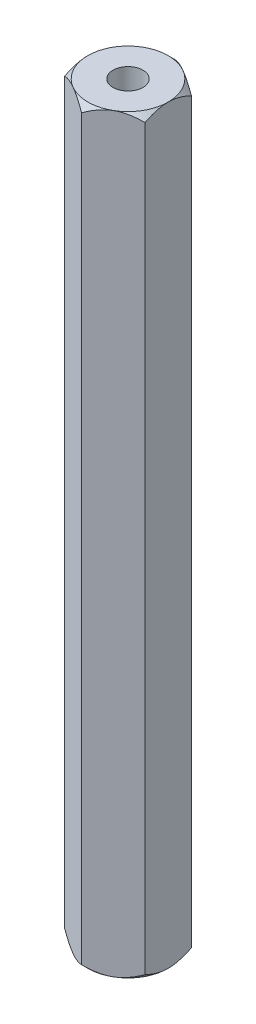
ISO-10303-21;
HEADER;
FILE_DESCRIPTION(('STEP AP214'),'2;1');
FILE_NAME('part.step','',(''),(''),'','','');
FILE_SCHEMA(('AUTOMOTIVE_DESIGN { 1 0 10303 214 1 1 1 1 }'));
ENDSEC;
DATA;
#1=APPLICATION_CONTEXT('core data for automotive mechanical design processes');
#2=APPLICATION_PROTOCOL_DEFINITION('international standard','automotive_design',2000,#1);
#3=PRODUCT_CONTEXT('',#1,'mechanical');
#4=PRODUCT('Part','Part','',(#3));
#5=PRODUCT_RELATED_PRODUCT_CATEGORY('part','',(#4));
#6=PRODUCT_DEFINITION_FORMATION('','',#4);
#7=PRODUCT_DEFINITION_CONTEXT('part definition',#1,'design');
#8=PRODUCT_DEFINITION('design','',#6,#7);
#9=PRODUCT_DEFINITION_SHAPE('','',#8);
#10=(LENGTH_UNIT() NAMED_UNIT(*) SI_UNIT(.MILLI.,.METRE.));
#11=(NAMED_UNIT(*) PLANE_ANGLE_UNIT() SI_UNIT($,.RADIAN.));
#12=(NAMED_UNIT(*) SI_UNIT($,.STERADIAN.) SOLID_ANGLE_UNIT());
#13=UNCERTAINTY_MEASURE_WITH_UNIT(LENGTH_MEASURE(1.E-05),#10,'distance_accuracy_value','');
#14=(GEOMETRIC_REPRESENTATION_CONTEXT(3) GLOBAL_UNCERTAINTY_ASSIGNED_CONTEXT((#13)) GLOBAL_UNIT_ASSIGNED_CONTEXT((#10,
#11,#12)) REPRESENTATION_CONTEXT('',''));
#15=CARTESIAN_POINT('',(0.,0.,0.));
#16=DIRECTION('',(0.,0.,1.));
#17=DIRECTION('',(1.,0.,0.));
#18=AXIS2_PLACEMENT_3D('',#15,#16,#17);
#19=CARTESIAN_POINT('',(0.,21.43125,0.));
#20=DIRECTION('',(0.,-1.,0.));
#21=DIRECTION('',(0.,0.,-1.));
#22=AXIS2_PLACEMENT_3D('',#19,#20,#21);
#23=CONICAL_SURFACE('',#22,3.17499999999999,0.78539816339745);
#24=CARTESIAN_POINT('',(0.000199999999997416,21.8565038656572,-2.74974612706943));
#25=CARTESIAN_POINT('',(-0.0816567823790523,21.9037244462749,-2.70248609172789));
#26=CARTESIAN_POINT('',(-0.164882333771762,21.9481717676915,-2.65443579722786));
#27=CARTESIAN_POINT('',(-0.334588480838042,22.0295538859988,-2.556455907536));
#28=CARTESIAN_POINT('',(-0.421085217353104,22.0664433998893,-2.50651699342501));
#29=CARTESIAN_POINT('',(-0.595501774009044,22.1296359298185,-2.40581754748857));
#30=CARTESIAN_POINT('',(-0.683377171180676,22.1560977842549,-2.35508266327639));
#31=CARTESIAN_POINT('',(-0.861062594070877,22.1968678273683,-2.25249593653966));
#32=CARTESIAN_POINT('',(-0.950867191185872,22.2112064514539,-2.20064722822085));
#33=CARTESIAN_POINT('',(-1.10563960313034,22.2241435582143,-2.11128933452158));
#34=CARTESIAN_POINT('',(-1.17040744896962,22.2260587383312,-2.07389560129144));
#35=CARTESIAN_POINT('',(-1.29983727933557,22.2228327202167,-1.99916925388849));
#36=CARTESIAN_POINT('',(-1.36449921879336,22.2176890481273,-1.96183666573622));
#37=CARTESIAN_POINT('',(-1.4932125485774,22.2006380321128,-1.88752399013711));
#38=CARTESIAN_POINT('',(-1.55726317423486,22.1887231216351,-1.85054434417201));
#39=CARTESIAN_POINT('',(-1.68425683890528,22.1587836706324,-1.77722451768917));
#40=CARTESIAN_POINT('',(-1.74719996243583,22.140759598466,-1.74088428837517));
#41=CARTESIAN_POINT('',(-1.90842615073218,22.087250535432,-1.64780030516185));
#42=CARTESIAN_POINT('',(-2.00570949128784,22.0477319221122,-1.59163374230437));
#43=CARTESIAN_POINT('',(-2.14875606262557,21.9810189994336,-1.50904576583588));
#44=CARTESIAN_POINT('',(-2.19589628894397,21.9575791338731,-1.4818293434813));
#45=CARTESIAN_POINT('',(-2.28930352636664,21.9085626663249,-1.42790064981106));
#46=CARTESIAN_POINT('',(-2.33557105249682,21.8829873762175,-1.40118808114506));
#47=CARTESIAN_POINT('',(-2.38145,21.8565038656572,-1.37469985845396));
#48=B_SPLINE_CURVE_WITH_KNOTS('',3,(#24,#25,#26,#27,#28,#29,#30,#31,#32,#33,#34,#35,#36,#37,#38,
#39,#40,#41,#42,#43,#44,#45,#46,#47),.UNSPECIFIED.,.F.,.F.,(4,2,2,2,2,2,2,2,2,2,2,4),(0.,
0.317196610611948,0.636241461041217,0.95021895062922,1.26340583824126,1.48752413747844,
1.71172100167747,1.93616888974082,2.16059957440836,2.51709639744763,2.69486147369099,
2.87251813383154),.UNSPECIFIED.);
#49=CARTESIAN_POINT('',(-1.190625,22.225,-2.0622229927617));
#50=VERTEX_POINT('',#49);
#51=CARTESIAN_POINT('',(-2.38125,21.8566193429844,-1.3748153285078));
#52=VERTEX_POINT('',#51);
#53=EDGE_CURVE('E286',#50,#52,#48,.T.);
#54=ORIENTED_EDGE('',*,*,#53,.T.);
#55=CARTESIAN_POINT('',(-2.38125,19.7460178389184,-4.23692165340734));
#56=CARTESIAN_POINT('',(-2.38125,19.8548125236186,-4.11207408962987));
#57=CARTESIAN_POINT('',(-2.38125,19.9630014982928,-3.98668790260333));
#58=CARTESIAN_POINT('',(-2.38125,20.1777354881861,-3.73441810760014));
#59=CARTESIAN_POINT('',(-2.38125,20.2842797259239,-3.60753383863596));
#60=CARTESIAN_POINT('',(-2.38125,20.4974570376868,-3.34921570361434));
#61=CARTESIAN_POINT('',(-2.38125,20.6040428221965,-3.21774266328135));
#62=CARTESIAN_POINT('',(-2.38125,20.8141107117806,-2.95238137001465));
#63=CARTESIAN_POINT('',(-2.38125,20.9175935793291,-2.81849372358448));
#64=CARTESIAN_POINT('',(-2.38125,21.1203990566302,-2.54733796573122));
#65=CARTESIAN_POINT('',(-2.38125,21.219716629089,-2.41006606284992));
#66=CARTESIAN_POINT('',(-2.38125,21.4122452338709,-2.13108753164403));
#67=CARTESIAN_POINT('',(-2.38125,21.5054513369965,-1.98937745657954));
#68=CARTESIAN_POINT('',(-2.38125,21.6819629013168,-1.70118513215734));
#69=CARTESIAN_POINT('',(-2.38125,21.7653318953251,-1.55474228924242));
#70=CARTESIAN_POINT('',(-2.38125,21.9178014544045,-1.25461518832165));
#71=CARTESIAN_POINT('',(-2.38125,21.9869274601571,-1.10094445470233));
#72=CARTESIAN_POINT('',(-2.38125,22.0747135361304,-0.862507140317603));
#73=CARTESIAN_POINT('',(-2.38125,22.1015288781413,-0.780759492808724));
#74=CARTESIAN_POINT('',(-2.38125,22.1480844456031,-0.615248355582293));
#75=CARTESIAN_POINT('',(-2.38125,22.1678257927441,-0.531485187706184));
#76=CARTESIAN_POINT('',(-2.38125,22.1989062943779,-0.362976040255643));
#77=CARTESIAN_POINT('',(-2.38125,22.2103018885502,-0.278240673845105));
#78=CARTESIAN_POINT('',(-2.38125,22.2240588979948,-0.108033963192984));
#79=CARTESIAN_POINT('',(-2.38125,22.2264215457668,-0.0225627209530799));
#80=CARTESIAN_POINT('',(-2.38125,22.2219174569688,0.148355479066417));
#81=CARTESIAN_POINT('',(-2.38125,22.215026443502,0.2338017824342));
#82=CARTESIAN_POINT('',(-2.38125,22.1925180920211,0.403529191270725));
#83=CARTESIAN_POINT('',(-2.38125,22.1768989097756,0.487810046626343));
#84=CARTESIAN_POINT('',(-2.38125,22.1378625956526,0.655184541265272));
#85=CARTESIAN_POINT('',(-2.38125,22.11438738817,0.738264383097644));
#86=CARTESIAN_POINT('',(-2.38125,22.0609694307975,0.902285884014336));
#87=CARTESIAN_POINT('',(-2.38125,22.0310264661243,0.983227471990672));
#88=CARTESIAN_POINT('',(-2.38125,21.9596468381831,1.15832978615673));
#89=CARTESIAN_POINT('',(-2.38125,21.9171072102966,1.25203669101619));
#90=CARTESIAN_POINT('',(-2.38125,21.8263360756699,1.43667584399993));
#91=CARTESIAN_POINT('',(-2.38125,21.778101349194,1.52760648564567));
#92=CARTESIAN_POINT('',(-2.38125,21.6771984957892,1.70719604162251));
#93=CARTESIAN_POINT('',(-2.38125,21.6245215787469,1.79584997643514));
#94=CARTESIAN_POINT('',(-2.38125,21.5158329172287,1.97105123995943));
#95=CARTESIAN_POINT('',(-2.38125,21.4598218205245,2.05759897329521));
#96=CARTESIAN_POINT('',(-2.38125,21.3448810721502,2.22941136493859));
#97=CARTESIAN_POINT('',(-2.38125,21.2859371476221,2.31466643045074));
#98=CARTESIAN_POINT('',(-2.38125,21.1659625155816,2.48369898527541));
#99=CARTESIAN_POINT('',(-2.38125,21.104931650476,2.56747636227462));
#100=CARTESIAN_POINT('',(-2.38125,20.9195047612154,2.81675916297002));
#101=CARTESIAN_POINT('',(-2.38125,20.7926337415803,2.9804210230883));
#102=CARTESIAN_POINT('',(-2.38125,20.5142933094313,3.32964262177486));
#103=CARTESIAN_POINT('',(-2.38125,20.3620873231987,3.51460984589197));
#104=CARTESIAN_POINT('',(-2.38125,20.1317961899971,3.78850303570508));
#105=CARTESIAN_POINT('',(-2.38125,20.0551752052054,3.8786686422443));
#106=CARTESIAN_POINT('',(-2.38125,19.9011512426555,4.05829189566911));
#107=CARTESIAN_POINT('',(-2.38125,19.8237484589111,4.14774970883097));
#108=CARTESIAN_POINT('',(-2.38125,19.7460178389184,4.23692165340734));
#109=B_SPLINE_CURVE_WITH_KNOTS('',3,(#55,#56,#57,#58,#59,#60,#61,#62,#63,#64,#65,#66,#67,#68,
#69,#70,#71,#72,#73,#74,#75,#76,#77,#78,#79,#80,#81,#82,#83,#84,#85,#86,#87,#88,#89,#90,#91,#92,
#93,#94,#95,#96,#97,#98,#99,#100,#101,#102,#103,#104,#105,#106,#107,#108),.UNSPECIFIED.,.F.,.F.,
(4,2,2,2,2,2,2,2,2,2,2,2,2,2,2,2,2,2,2,2,2,2,2,2,2,2,4),(0.,0.496808752533735,0.993845571839994,
1.50156308552919,2.00915479893864,2.51734363803646,3.02593743855607,3.53104224715954,
4.0352368681621,4.29308389437332,4.55089001687884,4.80693615994982,5.06294736557488,
5.31963152813929,5.57636994768811,5.83504984607863,6.09373833611014,6.40221158013621,
6.7108600628119,7.02013430663186,7.32934865883775,7.64025230372572,7.95117947823041,
8.57228663680331,9.29083133298711,9.64580055102219,10.0006837433332),.UNSPECIFIED.);
#110=CARTESIAN_POINT('',(-2.38125,22.225,0.));
#111=VERTEX_POINT('',#110);
#112=EDGE_CURVE('E258',#52,#111,#109,.T.);
#113=ORIENTED_EDGE('',*,*,#112,.T.);
#114=CARTESIAN_POINT('',(0.,22.225,0.));
#115=DIRECTION('',(0.,-1.,0.));
#116=DIRECTION('',(0.,0.,-1.));
#117=AXIS2_PLACEMENT_3D('',#114,#115,#116);
#118=CIRCLE('',#117,2.38125);
#119=EDGE_CURVE('E162',#111,#50,#118,.T.);
#120=ORIENTED_EDGE('',*,*,#119,.T.);
#121=EDGE_LOOP('',(#54,#113,#120));
#122=FACE_BOUND('',#121,.T.);
#123=ADVANCED_FACE('F39',(#122),#23,.T.);
#124=CARTESIAN_POINT('',(-1.190625,22.225,2.0622229927617));
#125=VERTEX_POINT('',#124);
#126=EDGE_CURVE('E164',#125,#111,#118,.T.);
#127=ORIENTED_EDGE('',*,*,#126,.T.);
#128=CARTESIAN_POINT('',(-2.38125,21.8566193429844,1.3748153285078));
#129=VERTEX_POINT('',#128);
#130=EDGE_CURVE('E259',#111,#129,#109,.T.);
#131=ORIENTED_EDGE('',*,*,#130,.T.);
#132=CARTESIAN_POINT('',(-2.38145,21.8565038656572,1.37469985845396));
#133=CARTESIAN_POINT('',(-2.29959321762095,21.9037244462749,1.4219598937955));
#134=CARTESIAN_POINT('',(-2.21636766622824,21.9481717676915,1.47001018829554));
#135=CARTESIAN_POINT('',(-2.04666151916196,22.0295538859988,1.56799007798739));
#136=CARTESIAN_POINT('',(-1.9601647826469,22.0664433998893,1.61792899209838));
#137=CARTESIAN_POINT('',(-1.78574822599096,22.1296359298185,1.71862843803482));
#138=CARTESIAN_POINT('',(-1.69787282881932,22.1560977842549,1.76936332224701));
#139=CARTESIAN_POINT('',(-1.52018740592912,22.1968678273683,1.87195004898374));
#140=CARTESIAN_POINT('',(-1.43038280881413,22.2112064514539,1.92379875730254));
#141=CARTESIAN_POINT('',(-1.27561039686966,22.2241435582143,2.01315665100181));
#142=CARTESIAN_POINT('',(-1.21084255103038,22.2260587383312,2.05055038423195));
#143=CARTESIAN_POINT('',(-1.08141272066443,22.2228327202167,2.1252767316349));
#144=CARTESIAN_POINT('',(-1.01675078120664,22.2176890481273,2.16260931978718));
#145=CARTESIAN_POINT('',(-0.888037451422602,22.2006380321128,2.23692199538629));
#146=CARTESIAN_POINT('',(-0.823986825765145,22.1887231216351,2.27390164135138));
#147=CARTESIAN_POINT('',(-0.696993161094725,22.1587836706324,2.34722146783423));
#148=CARTESIAN_POINT('',(-0.634050037564174,22.140759598466,2.38356169714823));
#149=CARTESIAN_POINT('',(-0.472823849267818,22.087250535432,2.47664568036154));
#150=CARTESIAN_POINT('',(-0.375540508712161,22.0477319221122,2.53281224321902));
#151=CARTESIAN_POINT('',(-0.232493937374431,21.9810189994336,2.61540021968751));
#152=CARTESIAN_POINT('',(-0.185353711056037,21.9575791338731,2.6426166420421));
#153=CARTESIAN_POINT('',(-0.0919464736333631,21.9085626663249,2.69654533571233));
#154=CARTESIAN_POINT('',(-0.0456789475031797,21.8829873762176,2.72325790437833));
#155=CARTESIAN_POINT('',(0.000199999999998351,21.8565038656572,2.74974612706943));
#156=B_SPLINE_CURVE_WITH_KNOTS('',3,(#132,#133,#134,#135,#136,#137,#138,#139,#140,#141,#142,
#143,#144,#145,#146,#147,#148,#149,#150,#151,#152,#153,#154,#155),.UNSPECIFIED.,.F.,.F.,(4,2,2,
2,2,2,2,2,2,2,2,4),(0.,0.317196610611949,0.63624146104122,0.950218950629223,1.26340583824126,
1.48752413747844,1.71172100167747,1.93616888974082,2.16059957440836,2.51709639744763,
2.69486147369099,2.87251813383154),.UNSPECIFIED.);
#157=EDGE_CURVE('E335',#129,#125,#156,.T.);
#158=ORIENTED_EDGE('',*,*,#157,.T.);
#159=EDGE_LOOP('',(#127,#131,#158));
#160=FACE_BOUND('',#159,.T.);
#161=ADVANCED_FACE('F334',(#160),#23,.T.);
#162=CARTESIAN_POINT('',(1.190625,22.225,2.0622229927617));
#163=VERTEX_POINT('',#162);
#164=EDGE_CURVE('E147',#163,#125,#118,.T.);
#165=ORIENTED_EDGE('',*,*,#164,.T.);
#166=CARTESIAN_POINT('',(0.,21.8566193429844,2.74963065701559));
#167=VERTEX_POINT('',#166);
#168=EDGE_CURVE('E264',#125,#167,#156,.T.);
#169=ORIENTED_EDGE('',*,*,#168,.T.);
#170=CARTESIAN_POINT('',(-0.000200000000000422,21.8565038656572,2.74974612706943));
#171=CARTESIAN_POINT('',(0.0816567823790491,21.9037244462749,2.70248609172789));
#172=CARTESIAN_POINT('',(0.164882333771759,21.9481717676915,2.65443579722785));
#173=CARTESIAN_POINT('',(0.334588480838039,22.0295538859988,2.556455907536));
#174=CARTESIAN_POINT('',(0.421085217353103,22.0664433998893,2.50651699342501));
#175=CARTESIAN_POINT('',(0.595501774009043,22.1296359298185,2.40581754748857));
#176=CARTESIAN_POINT('',(0.683377171180675,22.1560977842549,2.35508266327639));
#177=CARTESIAN_POINT('',(0.861062594070875,22.1968678273684,2.25249593653966));
#178=CARTESIAN_POINT('',(0.95086719118587,22.2112064514539,2.20064722822085));
#179=CARTESIAN_POINT('',(1.10563960313034,22.2241435582143,2.11128933452158));
#180=CARTESIAN_POINT('',(1.17040744896962,22.2260587383312,2.07389560129144));
#181=CARTESIAN_POINT('',(1.29983727933557,22.2228327202167,1.99916925388849));
#182=CARTESIAN_POINT('',(1.36449921879335,22.2176890481273,1.96183666573622));
#183=CARTESIAN_POINT('',(1.4932125485774,22.2006380321128,1.88752399013711));
#184=CARTESIAN_POINT('',(1.55726317423485,22.1887231216351,1.85054434417201));
#185=CARTESIAN_POINT('',(1.68425683890527,22.1587836706324,1.77722451768917));
#186=CARTESIAN_POINT('',(1.74719996243582,22.140759598466,1.74088428837517));
#187=CARTESIAN_POINT('',(1.90842615073218,22.087250535432,1.64780030516185));
#188=CARTESIAN_POINT('',(2.00570949128784,22.0477319221122,1.59163374230437));
#189=CARTESIAN_POINT('',(2.14875606262557,21.9810189994336,1.50904576583588));
#190=CARTESIAN_POINT('',(2.19589628894396,21.9575791338731,1.4818293434813));
#191=CARTESIAN_POINT('',(2.28930352636664,21.9085626663249,1.42790064981106));
#192=CARTESIAN_POINT('',(2.33557105249682,21.8829873762176,1.40118808114506));
#193=CARTESIAN_POINT('',(2.38145,21.8565038656572,1.37469985845396));
#194=B_SPLINE_CURVE_WITH_KNOTS('',3,(#170,#171,#172,#173,#174,#175,#176,#177,#178,#179,#180,
#181,#182,#183,#184,#185,#186,#187,#188,#189,#190,#191,#192,#193),.UNSPECIFIED.,.F.,.F.,(4,2,2,
2,2,2,2,2,2,2,2,4),(0.,0.317196610611948,0.636241461041218,0.950218950629222,1.26340583824126,
1.48752413747844,1.71172100167747,1.93616888974082,2.16059957440836,2.51709639744763,
2.69486147369099,2.87251813383154),.UNSPECIFIED.);
#195=EDGE_CURVE('E175',#167,#163,#194,.T.);
#196=ORIENTED_EDGE('',*,*,#195,.T.);
#197=EDGE_LOOP('',(#165,#169,#196));
#198=FACE_BOUND('',#197,.T.);
#199=ADVANCED_FACE('F340',(#198),#23,.T.);
#200=CARTESIAN_POINT('',(2.38145,21.8565038656572,-1.37469985845396));
#201=CARTESIAN_POINT('',(2.29959321762095,21.9037244462749,-1.4219598937955));
#202=CARTESIAN_POINT('',(2.21636766622824,21.9481717676915,-1.47001018829554));
#203=CARTESIAN_POINT('',(2.04666151916196,22.0295538859988,-1.56799007798739));
#204=CARTESIAN_POINT('',(1.9601647826469,22.0664433998893,-1.61792899209838));
#205=CARTESIAN_POINT('',(1.78574822599096,22.1296359298185,-1.71862843803482));
#206=CARTESIAN_POINT('',(1.69787282881933,22.1560977842549,-1.769363322247));
#207=CARTESIAN_POINT('',(1.52018740592912,22.1968678273684,-1.87195004898373));
#208=CARTESIAN_POINT('',(1.43038280881413,22.2112064514539,-1.92379875730254));
#209=CARTESIAN_POINT('',(1.27561039686966,22.2241435582143,-2.01315665100181));
#210=CARTESIAN_POINT('',(1.21084255103038,22.2260587383312,-2.05055038423195));
#211=CARTESIAN_POINT('',(1.08141272066443,22.2228327202167,-2.1252767316349));
#212=CARTESIAN_POINT('',(1.01675078120664,22.2176890481273,-2.16260931978717));
#213=CARTESIAN_POINT('',(0.888037451422603,22.2006380321128,-2.23692199538628));
#214=CARTESIAN_POINT('',(0.823986825765146,22.1887231216351,-2.27390164135138));
#215=CARTESIAN_POINT('',(0.696993161094726,22.1587836706324,-2.34722146783422));
#216=CARTESIAN_POINT('',(0.634050037564175,22.140759598466,-2.38356169714822));
#217=CARTESIAN_POINT('',(0.472823849267818,22.087250535432,-2.47664568036154));
#218=CARTESIAN_POINT('',(0.37554050871216,22.0477319221122,-2.53281224321902));
#219=CARTESIAN_POINT('',(0.23249393737443,21.9810189994336,-2.61540021968751));
#220=CARTESIAN_POINT('',(0.185353711056035,21.9575791338731,-2.64261664204209));
#221=CARTESIAN_POINT('',(0.0919464736333613,21.9085626663249,-2.69654533571233));
#222=CARTESIAN_POINT('',(0.0456789475031778,21.8829873762176,-2.72325790437833));
#223=CARTESIAN_POINT('',(-0.000200000000001203,21.8565038656572,-2.74974612706943));
#224=B_SPLINE_CURVE_WITH_KNOTS('',3,(#200,#201,#202,#203,#204,#205,#206,#207,#208,#209,#210,
#211,#212,#213,#214,#215,#216,#217,#218,#219,#220,#221,#222,#223),.UNSPECIFIED.,.F.,.F.,(4,2,2,
2,2,2,2,2,2,2,2,4),(0.,0.317196610611948,0.636241461041218,0.950218950629222,1.26340583824126,
1.48752413747844,1.71172100167747,1.93616888974082,2.16059957440836,2.51709639744763,
2.69486147369099,2.87251813383154),.UNSPECIFIED.);
#225=CARTESIAN_POINT('',(1.190625,22.225,-2.06222299276169));
#226=VERTEX_POINT('',#225);
#227=CARTESIAN_POINT('',(0.,21.8566193429844,-2.74963065701559));
#228=VERTEX_POINT('',#227);
#229=EDGE_CURVE('E153',#226,#228,#224,.T.);
#230=ORIENTED_EDGE('',*,*,#229,.T.);
#231=EDGE_CURVE('E159',#228,#50,#48,.T.);
#232=ORIENTED_EDGE('',*,*,#231,.T.);
#233=EDGE_CURVE('E48',#50,#226,#118,.T.);
#234=ORIENTED_EDGE('',*,*,#233,.T.);
#235=EDGE_LOOP('',(#230,#232,#234));
#236=FACE_BOUND('',#235,.T.);
#237=ADVANCED_FACE('F158',(#236),#23,.T.);
#238=CARTESIAN_POINT('',(2.38125,22.225,0.));
#239=VERTEX_POINT('',#238);
#240=EDGE_CURVE('E47',#239,#163,#118,.T.);
#241=ORIENTED_EDGE('',*,*,#240,.T.);
#242=CARTESIAN_POINT('',(2.38125,21.8566193429844,1.3748153285078));
#243=VERTEX_POINT('',#242);
#244=EDGE_CURVE('E139',#163,#243,#194,.T.);
#245=ORIENTED_EDGE('',*,*,#244,.T.);
#246=CARTESIAN_POINT('',(2.38125,19.7460178389184,4.23692165340734));
#247=CARTESIAN_POINT('',(2.38125,19.8548125236186,4.11207408962987));
#248=CARTESIAN_POINT('',(2.38125,19.9630014982928,3.98668790260332));
#249=CARTESIAN_POINT('',(2.38125,20.1777354881861,3.73441810760013));
#250=CARTESIAN_POINT('',(2.38125,20.2842797259239,3.60753383863596));
#251=CARTESIAN_POINT('',(2.38125,20.4974570376868,3.34921570361434));
#252=CARTESIAN_POINT('',(2.38125,20.6040428221965,3.21774266328135));
#253=CARTESIAN_POINT('',(2.38125,20.8141107117806,2.95238137001464));
#254=CARTESIAN_POINT('',(2.38125,20.9175935793291,2.81849372358447));
#255=CARTESIAN_POINT('',(2.38125,21.1203990566302,2.54733796573121));
#256=CARTESIAN_POINT('',(2.38125,21.219716629089,2.41006606284991));
#257=CARTESIAN_POINT('',(2.38125,21.4122452338709,2.13108753164403));
#258=CARTESIAN_POINT('',(2.38125,21.5054513369965,1.98937745657954));
#259=CARTESIAN_POINT('',(2.38125,21.6819629013168,1.70118513215734));
#260=CARTESIAN_POINT('',(2.38125,21.7653318953251,1.55474228924241));
#261=CARTESIAN_POINT('',(2.38125,21.9178014544045,1.25461518832165));
#262=CARTESIAN_POINT('',(2.38125,21.9869274601571,1.10094445470233));
#263=CARTESIAN_POINT('',(2.38125,22.0747135361304,0.862507140317599));
#264=CARTESIAN_POINT('',(2.38125,22.1015288781413,0.78075949280872));
#265=CARTESIAN_POINT('',(2.38125,22.1480844456031,0.615248355582289));
#266=CARTESIAN_POINT('',(2.38125,22.1678257927441,0.531485187706181));
#267=CARTESIAN_POINT('',(2.38125,22.1989062943779,0.36297604025564));
#268=CARTESIAN_POINT('',(2.38125,22.2103018885502,0.278240673845103));
#269=CARTESIAN_POINT('',(2.38125,22.2240588979948,0.108033963192981));
#270=CARTESIAN_POINT('',(2.38125,22.2264215457668,0.0225627209530779));
#271=CARTESIAN_POINT('',(2.38125,22.2219174569688,-0.148355479066419));
#272=CARTESIAN_POINT('',(2.38125,22.215026443502,-0.233801782434202));
#273=CARTESIAN_POINT('',(2.38125,22.1925180920211,-0.403529191270727));
#274=CARTESIAN_POINT('',(2.38125,22.1768989097756,-0.487810046626345));
#275=CARTESIAN_POINT('',(2.38125,22.1378625956526,-0.655184541265273));
#276=CARTESIAN_POINT('',(2.38125,22.11438738817,-0.738264383097644));
#277=CARTESIAN_POINT('',(2.38125,22.0609694307975,-0.902285884014336));
#278=CARTESIAN_POINT('',(2.38125,22.0310264661243,-0.983227471990672));
#279=CARTESIAN_POINT('',(2.38125,21.9596468381831,-1.15832978615673));
#280=CARTESIAN_POINT('',(2.38125,21.9171072102966,-1.25203669101619));
#281=CARTESIAN_POINT('',(2.38125,21.8263360756699,-1.43667584399993));
#282=CARTESIAN_POINT('',(2.38125,21.778101349194,-1.52760648564567));
#283=CARTESIAN_POINT('',(2.38125,21.6771984957892,-1.70719604162251));
#284=CARTESIAN_POINT('',(2.38125,21.624521578747,-1.79584997643514));
#285=CARTESIAN_POINT('',(2.38125,21.5158329172287,-1.97105123995943));
#286=CARTESIAN_POINT('',(2.38125,21.4598218205245,-2.05759897329521));
#287=CARTESIAN_POINT('',(2.38125,21.3448810721502,-2.22941136493859));
#288=CARTESIAN_POINT('',(2.38125,21.2859371476221,-2.31466643045074));
#289=CARTESIAN_POINT('',(2.38125,21.1659625155816,-2.48369898527541));
#290=CARTESIAN_POINT('',(2.38125,21.1049316504761,-2.56747636227462));
#291=CARTESIAN_POINT('',(2.38125,20.9195047612154,-2.81675916297002));
#292=CARTESIAN_POINT('',(2.38125,20.7926337415803,-2.9804210230883));
#293=CARTESIAN_POINT('',(2.38125,20.5142933094313,-3.32964262177485));
#294=CARTESIAN_POINT('',(2.38125,20.3620873231987,-3.51460984589197));
#295=CARTESIAN_POINT('',(2.38125,20.1317961899971,-3.78850303570508));
#296=CARTESIAN_POINT('',(2.38125,20.0551752052054,-3.8786686422443));
#297=CARTESIAN_POINT('',(2.38125,19.9011512426555,-4.05829189566911));
#298=CARTESIAN_POINT('',(2.38125,19.8237484589111,-4.14774970883097));
#299=CARTESIAN_POINT('',(2.38125,19.7460178389184,-4.23692165340734));
#300=B_SPLINE_CURVE_WITH_KNOTS('',3,(#246,#247,#248,#249,#250,#251,#252,#253,#254,#255,#256,
#257,#258,#259,#260,#261,#262,#263,#264,#265,#266,#267,#268,#269,#270,#271,#272,#273,#274,#275,
#276,#277,#278,#279,#280,#281,#282,#283,#284,#285,#286,#287,#288,#289,#290,#291,#292,#293,#294,
#295,#296,#297,#298,#299),.UNSPECIFIED.,.F.,.F.,(4,2,2,2,2,2,2,2,2,2,2,2,2,2,2,2,2,2,2,2,2,2,2,
2,2,2,4),(0.,0.496808752533733,0.993845571839992,1.50156308552918,2.00915479893864,
2.51734363803646,3.02593743855607,3.53104224715954,4.0352368681621,4.29308389437332,
4.55089001687884,4.80693615994982,5.06294736557488,5.31963152813929,5.57636994768811,
5.83504984607863,6.09373833611014,6.4022115801362,6.71086006281189,7.02013430663186,
7.32934865883775,7.64025230372572,7.95117947823041,8.57228663680331,9.2908313329871,
9.64580055102219,10.0006837433332),.UNSPECIFIED.);
#301=EDGE_CURVE('E129',#243,#239,#300,.T.);
#302=ORIENTED_EDGE('',*,*,#301,.T.);
#303=EDGE_LOOP('',(#241,#245,#302));
#304=FACE_BOUND('',#303,.T.);
#305=ADVANCED_FACE('F138',(#304),#23,.T.);
#306=CARTESIAN_POINT('',(2.38125,21.8566193429844,-1.3748153285078));
#307=VERTEX_POINT('',#306);
#308=EDGE_CURVE('E126',#239,#307,#300,.T.);
#309=ORIENTED_EDGE('',*,*,#308,.T.);
#310=EDGE_CURVE('E149',#307,#226,#224,.T.);
#311=ORIENTED_EDGE('',*,*,#310,.T.);
#312=EDGE_CURVE('E12',#226,#239,#118,.T.);
#313=ORIENTED_EDGE('',*,*,#312,.T.);
#314=EDGE_LOOP('',(#309,#311,#313));
#315=FACE_BOUND('',#314,.T.);
#316=ADVANCED_FACE('F148',(#315),#23,.T.);
#317=CARTESIAN_POINT('',(0.,22.225,0.));
#318=DIRECTION('',(0.,1.,0.));
#319=DIRECTION('',(0.,0.,1.));
#320=AXIS2_PLACEMENT_3D('',#317,#318,#319);
#321=PLANE('',#320);
#322=CARTESIAN_POINT('',(0.,22.225,0.));
#323=DIRECTION('',(0.,-1.,0.));
#324=DIRECTION('',(0.,0.,-1.));
#325=AXIS2_PLACEMENT_3D('',#322,#323,#324);
#326=CIRCLE('',#325,0.888999999999994);
#327=CARTESIAN_POINT('',(0.,22.225,-0.888999999999994));
#328=VERTEX_POINT('',#327);
#329=EDGE_CURVE('E315',#328,#328,#326,.T.);
#330=ORIENTED_EDGE('',*,*,#329,.T.);
#331=EDGE_LOOP('',(#330));
#332=FACE_BOUND('',#331,.T.);
#333=ORIENTED_EDGE('',*,*,#312,.F.);
#334=ORIENTED_EDGE('',*,*,#233,.F.);
#335=ORIENTED_EDGE('',*,*,#119,.F.);
#336=ORIENTED_EDGE('',*,*,#126,.F.);
#337=ORIENTED_EDGE('',*,*,#164,.F.);
#338=ORIENTED_EDGE('',*,*,#240,.F.);
#339=EDGE_LOOP('',(#333,#334,#335,#336,#337,#338));
#340=FACE_BOUND('',#339,.T.);
#341=ADVANCED_FACE('F41',(#332,#340),#321,.T.);
#342=CARTESIAN_POINT('',(0.,-22.225,2.74963065701559));
#343=DIRECTION('',(0.5,0.,0.866025403784439));
#344=DIRECTION('',(0.866025403784439,0.,-0.5));
#345=AXIS2_PLACEMENT_3D('',#342,#343,#344);
#346=PLANE('',#345);
#347=DIRECTION('',(0.,1.,0.));
#348=VECTOR('',#347,1.);
#349=CARTESIAN_POINT('',(0.,-22.225,2.74963065701559));
#350=LINE('',#349,#348);
#351=CARTESIAN_POINT('',(0.,-21.8566193429844,2.74963065701559));
#352=VERTEX_POINT('',#351);
#353=EDGE_CURVE('E324',#352,#167,#350,.T.);
#354=ORIENTED_EDGE('',*,*,#353,.F.);
#355=CARTESIAN_POINT('',(2.38145,-21.8565038656572,1.37469985845396));
#356=CARTESIAN_POINT('',(2.29959321762095,-21.9037244462749,1.4219598937955));
#357=CARTESIAN_POINT('',(2.21636766622824,-21.9481717676915,1.47001018829554));
#358=CARTESIAN_POINT('',(2.04666151916196,-22.0295538859988,1.56799007798739));
#359=CARTESIAN_POINT('',(1.9601647826469,-22.0664433998893,1.61792899209838));
#360=CARTESIAN_POINT('',(1.78574822599096,-22.1296359298185,1.71862843803482));
#361=CARTESIAN_POINT('',(1.69787282881933,-22.1560977842549,1.769363322247));
#362=CARTESIAN_POINT('',(1.52018740592913,-22.1968678273684,1.87195004898373));
#363=CARTESIAN_POINT('',(1.43038280881413,-22.2112064514539,1.92379875730254));
#364=CARTESIAN_POINT('',(1.27561039686966,-22.2241435582143,2.01315665100181));
#365=CARTESIAN_POINT('',(1.21084255103038,-22.2260587383312,2.05055038423195));
#366=CARTESIAN_POINT('',(1.08141272066443,-22.2228327202167,2.1252767316349));
#367=CARTESIAN_POINT('',(1.01675078120665,-22.2176890481273,2.16260931978717));
#368=CARTESIAN_POINT('',(0.888037451422605,-22.2006380321128,2.23692199538628));
#369=CARTESIAN_POINT('',(0.823986825765147,-22.1887231216351,2.27390164135138));
#370=CARTESIAN_POINT('',(0.696993161094728,-22.1587836706324,2.34722146783422));
#371=CARTESIAN_POINT('',(0.634050037564177,-22.140759598466,2.38356169714822));
#372=CARTESIAN_POINT('',(0.47282384926782,-22.087250535432,2.47664568036154));
#373=CARTESIAN_POINT('',(0.375540508712161,-22.0477319221122,2.53281224321902));
#374=CARTESIAN_POINT('',(0.23249393737443,-21.9810189994336,2.61540021968751));
#375=CARTESIAN_POINT('',(0.185353711056036,-21.9575791338731,2.6426166420421));
#376=CARTESIAN_POINT('',(0.0919464736333615,-21.9085626663249,2.69654533571234));
#377=CARTESIAN_POINT('',(0.0456789475031781,-21.8829873762176,2.72325790437834));
#378=CARTESIAN_POINT('',(-0.000200000000000642,-21.8565038656572,2.74974612706943));
#379=B_SPLINE_CURVE_WITH_KNOTS('',3,(#355,#356,#357,#358,#359,#360,#361,#362,#363,#364,#365,
#366,#367,#368,#369,#370,#371,#372,#373,#374,#375,#376,#377,#378),.UNSPECIFIED.,.F.,.F.,(4,2,2,
2,2,2,2,2,2,2,2,4),(0.,0.317196610611948,0.636241461041218,0.950218950629222,1.26340583824126,
1.48752413747844,1.71172100167747,1.93616888974082,2.16059957440836,2.51709639744763,
2.69486147369099,2.87251813383154),.UNSPECIFIED.);
#380=CARTESIAN_POINT('',(1.190625,-22.225,2.0622229927617));
#381=VERTEX_POINT('',#380);
#382=EDGE_CURVE('E189',#381,#352,#379,.T.);
#383=ORIENTED_EDGE('',*,*,#382,.F.);
#384=CARTESIAN_POINT('',(2.38125,-21.8566193429844,1.3748153285078));
#385=VERTEX_POINT('',#384);
#386=EDGE_CURVE('E182',#385,#381,#379,.T.);
#387=ORIENTED_EDGE('',*,*,#386,.F.);
#388=DIRECTION('',(0.,1.,0.));
#389=VECTOR('',#388,1.);
#390=CARTESIAN_POINT('',(2.38125,-22.225,1.3748153285078));
#391=LINE('',#390,#389);
#392=EDGE_CURVE('E62',#385,#243,#391,.T.);
#393=ORIENTED_EDGE('',*,*,#392,.T.);
#394=ORIENTED_EDGE('',*,*,#244,.F.);
#395=ORIENTED_EDGE('',*,*,#195,.F.);
#396=EDGE_LOOP('',(#354,#383,#387,#393,#394,#395));
#397=FACE_BOUND('',#396,.T.);
#398=ADVANCED_FACE('F197',(#397),#346,.T.);
#399=CARTESIAN_POINT('',(-2.38125,-22.225,1.3748153285078));
#400=DIRECTION('',(-0.5,0.,0.866025403784439));
#401=DIRECTION('',(0.866025403784439,0.,0.5));
#402=AXIS2_PLACEMENT_3D('',#399,#400,#401);
#403=PLANE('',#402);
#404=DIRECTION('',(0.,1.,0.));
#405=VECTOR('',#404,1.);
#406=CARTESIAN_POINT('',(-2.38125,-22.225,1.3748153285078));
#407=LINE('',#406,#405);
#408=CARTESIAN_POINT('',(-2.38125,-21.8566193429844,1.3748153285078));
#409=VERTEX_POINT('',#408);
#410=EDGE_CURVE('E311',#409,#129,#407,.T.);
#411=ORIENTED_EDGE('',*,*,#410,.F.);
#412=CARTESIAN_POINT('',(0.000199999999999241,-21.8565038656572,2.74974612706943));
#413=CARTESIAN_POINT('',(-0.0816567823790509,-21.9037244462749,2.70248609172789));
#414=CARTESIAN_POINT('',(-0.164882333771761,-21.9481717676915,2.65443579722785));
#415=CARTESIAN_POINT('',(-0.33458848083804,-22.0295538859988,2.556455907536));
#416=CARTESIAN_POINT('',(-0.421085217353103,-22.0664433998893,2.50651699342501));
#417=CARTESIAN_POINT('',(-0.595501774009043,-22.1296359298185,2.40581754748857));
#418=CARTESIAN_POINT('',(-0.683377171180675,-22.1560977842549,2.35508266327639));
#419=CARTESIAN_POINT('',(-0.861062594070877,-22.1968678273684,2.25249593653966));
#420=CARTESIAN_POINT('',(-0.950867191185872,-22.2112064514539,2.20064722822085));
#421=CARTESIAN_POINT('',(-1.10563960313034,-22.2241435582143,2.11128933452158));
#422=CARTESIAN_POINT('',(-1.17040744896962,-22.2260587383312,2.07389560129144));
#423=CARTESIAN_POINT('',(-1.29983727933558,-22.2228327202167,1.99916925388849));
#424=CARTESIAN_POINT('',(-1.36449921879336,-22.2176890481273,1.96183666573622));
#425=CARTESIAN_POINT('',(-1.4932125485774,-22.2006380321128,1.88752399013711));
#426=CARTESIAN_POINT('',(-1.55726317423486,-22.1887231216351,1.85054434417201));
#427=CARTESIAN_POINT('',(-1.68425683890527,-22.1587836706324,1.77722451768917));
#428=CARTESIAN_POINT('',(-1.74719996243583,-22.140759598466,1.74088428837517));
#429=CARTESIAN_POINT('',(-1.90842615073218,-22.087250535432,1.64780030516185));
#430=CARTESIAN_POINT('',(-2.00570949128784,-22.0477319221122,1.59163374230437));
#431=CARTESIAN_POINT('',(-2.14875606262557,-21.9810189994336,1.50904576583588));
#432=CARTESIAN_POINT('',(-2.19589628894397,-21.9575791338731,1.4818293434813));
#433=CARTESIAN_POINT('',(-2.28930352636664,-21.9085626663249,1.42790064981106));
#434=CARTESIAN_POINT('',(-2.33557105249682,-21.8829873762176,1.40118808114506));
#435=CARTESIAN_POINT('',(-2.38145,-21.8565038656572,1.37469985845396));
#436=B_SPLINE_CURVE_WITH_KNOTS('',3,(#412,#413,#414,#415,#416,#417,#418,#419,#420,#421,#422,
#423,#424,#425,#426,#427,#428,#429,#430,#431,#432,#433,#434,#435),.UNSPECIFIED.,.F.,.F.,(4,2,2,
2,2,2,2,2,2,2,2,4),(0.,0.317196610611948,0.636241461041218,0.950218950629222,1.26340583824126,
1.48752413747844,1.71172100167747,1.93616888974082,2.16059957440836,2.51709639744763,
2.69486147369099,2.87251813383154),.UNSPECIFIED.);
#437=CARTESIAN_POINT('',(-1.190625,-22.225,2.0622229927617));
#438=VERTEX_POINT('',#437);
#439=EDGE_CURVE('E250',#438,#409,#436,.T.);
#440=ORIENTED_EDGE('',*,*,#439,.F.);
#441=EDGE_CURVE('E257',#352,#438,#436,.T.);
#442=ORIENTED_EDGE('',*,*,#441,.F.);
#443=ORIENTED_EDGE('',*,*,#353,.T.);
#444=ORIENTED_EDGE('',*,*,#168,.F.);
#445=ORIENTED_EDGE('',*,*,#157,.F.);
#446=EDGE_LOOP('',(#411,#440,#442,#443,#444,#445));
#447=FACE_BOUND('',#446,.T.);
#448=ADVANCED_FACE('F202',(#447),#403,.T.);
#449=CARTESIAN_POINT('',(-2.38125,-22.225,-1.3748153285078));
#450=DIRECTION('',(-1.,0.,0.));
#451=DIRECTION('',(0.,0.,1.));
#452=AXIS2_PLACEMENT_3D('',#449,#450,#451);
#453=PLANE('',#452);
#454=DIRECTION('',(0.,1.,0.));
#455=VECTOR('',#454,1.);
#456=CARTESIAN_POINT('',(-2.38125,-22.225,-1.3748153285078));
#457=LINE('',#456,#455);
#458=CARTESIAN_POINT('',(-2.38125,-21.8566193429844,-1.3748153285078));
#459=VERTEX_POINT('',#458);
#460=EDGE_CURVE('E309',#459,#52,#457,.T.);
#461=ORIENTED_EDGE('',*,*,#460,.F.);
#462=CARTESIAN_POINT('',(-2.38125,-19.7460178389184,4.23692165340734));
#463=CARTESIAN_POINT('',(-2.38125,-19.8548125236186,4.11207408962987));
#464=CARTESIAN_POINT('',(-2.38125,-19.9630014982928,3.98668790260333));
#465=CARTESIAN_POINT('',(-2.38125,-20.1777354881862,3.73441810760013));
#466=CARTESIAN_POINT('',(-2.38125,-20.2842797259239,3.60753383863596));
#467=CARTESIAN_POINT('',(-2.38125,-20.4974570376868,3.34921570361434));
#468=CARTESIAN_POINT('',(-2.38125,-20.6040428221965,3.21774266328135));
#469=CARTESIAN_POINT('',(-2.38125,-20.8141107117806,2.95238137001464));
#470=CARTESIAN_POINT('',(-2.38125,-20.9175935793291,2.81849372358447));
#471=CARTESIAN_POINT('',(-2.38125,-21.1203990566302,2.54733796573121));
#472=CARTESIAN_POINT('',(-2.38125,-21.219716629089,2.41006606284991));
#473=CARTESIAN_POINT('',(-2.38125,-21.412245233871,2.13108753164403));
#474=CARTESIAN_POINT('',(-2.38125,-21.5054513369965,1.98937745657954));
#475=CARTESIAN_POINT('',(-2.38125,-21.6819629013169,1.70118513215734));
#476=CARTESIAN_POINT('',(-2.38125,-21.7653318953251,1.55474228924241));
#477=CARTESIAN_POINT('',(-2.38125,-21.9178014544045,1.25461518832165));
#478=CARTESIAN_POINT('',(-2.38125,-21.9869274601571,1.10094445470233));
#479=CARTESIAN_POINT('',(-2.38125,-22.0747135361304,0.862507140317599));
#480=CARTESIAN_POINT('',(-2.38125,-22.1015288781413,0.78075949280872));
#481=CARTESIAN_POINT('',(-2.38125,-22.1480844456031,0.61524835558229));
#482=CARTESIAN_POINT('',(-2.38125,-22.1678257927442,0.531485187706181));
#483=CARTESIAN_POINT('',(-2.38125,-22.1989062943779,0.36297604025564));
#484=CARTESIAN_POINT('',(-2.38125,-22.2103018885503,0.278240673845103));
#485=CARTESIAN_POINT('',(-2.38125,-22.2240588979948,0.108033963192982));
#486=CARTESIAN_POINT('',(-2.38125,-22.2264215457668,0.0225627209530785));
#487=CARTESIAN_POINT('',(-2.38125,-22.2219174569689,-0.148355479066418));
#488=CARTESIAN_POINT('',(-2.38125,-22.215026443502,-0.233801782434201));
#489=CARTESIAN_POINT('',(-2.38125,-22.1925180920211,-0.403529191270725));
#490=CARTESIAN_POINT('',(-2.38125,-22.1768989097756,-0.487810046626343));
#491=CARTESIAN_POINT('',(-2.38125,-22.1378625956526,-0.655184541265271));
#492=CARTESIAN_POINT('',(-2.38125,-22.11438738817,-0.738264383097642));
#493=CARTESIAN_POINT('',(-2.38125,-22.0609694307975,-0.902285884014333));
#494=CARTESIAN_POINT('',(-2.38125,-22.0310264661243,-0.98322747199067));
#495=CARTESIAN_POINT('',(-2.38125,-21.9596468381831,-1.15832978615673));
#496=CARTESIAN_POINT('',(-2.38125,-21.9171072102966,-1.25203669101619));
#497=CARTESIAN_POINT('',(-2.38125,-21.8263360756699,-1.43667584399992));
#498=CARTESIAN_POINT('',(-2.38125,-21.778101349194,-1.52760648564566));
#499=CARTESIAN_POINT('',(-2.38125,-21.6771984957892,-1.7071960416225));
#500=CARTESIAN_POINT('',(-2.38125,-21.624521578747,-1.79584997643513));
#501=CARTESIAN_POINT('',(-2.38125,-21.5158329172287,-1.97105123995942));
#502=CARTESIAN_POINT('',(-2.38125,-21.4598218205246,-2.0575989732952));
#503=CARTESIAN_POINT('',(-2.38125,-21.3448810721502,-2.22941136493858));
#504=CARTESIAN_POINT('',(-2.38125,-21.2859371476221,-2.31466643045073));
#505=CARTESIAN_POINT('',(-2.38125,-21.1659625155816,-2.4836989852754));
#506=CARTESIAN_POINT('',(-2.38125,-21.1049316504761,-2.56747636227461));
#507=CARTESIAN_POINT('',(-2.38125,-20.9195047612154,-2.81675916297001));
#508=CARTESIAN_POINT('',(-2.38125,-20.7926337415803,-2.98042102308829));
#509=CARTESIAN_POINT('',(-2.38125,-20.5142933094313,-3.32964262177485));
#510=CARTESIAN_POINT('',(-2.38125,-20.3620873231987,-3.51460984589197));
#511=CARTESIAN_POINT('',(-2.38125,-20.1317961899971,-3.78850303570508));
#512=CARTESIAN_POINT('',(-2.38125,-20.0551752052054,-3.8786686422443));
#513=CARTESIAN_POINT('',(-2.38125,-19.9011512426555,-4.05829189566911));
#514=CARTESIAN_POINT('',(-2.38125,-19.8237484589111,-4.14774970883097));
#515=CARTESIAN_POINT('',(-2.38125,-19.7460178389184,-4.23692165340734));
#516=B_SPLINE_CURVE_WITH_KNOTS('',3,(#462,#463,#464,#465,#466,#467,#468,#469,#470,#471,#472,
#473,#474,#475,#476,#477,#478,#479,#480,#481,#482,#483,#484,#485,#486,#487,#488,#489,#490,#491,
#492,#493,#494,#495,#496,#497,#498,#499,#500,#501,#502,#503,#504,#505,#506,#507,#508,#509,#510,
#511,#512,#513,#514,#515),.UNSPECIFIED.,.F.,.F.,(4,2,2,2,2,2,2,2,2,2,2,2,2,2,2,2,2,2,2,2,2,2,2,
2,2,2,4),(0.,0.496808752533736,0.993845571839996,1.50156308552919,2.00915479893865,
2.51734363803647,3.02593743855608,3.53104224715955,4.03523686816211,4.29308389437332,
4.55089001687884,4.80693615994983,5.06294736557489,5.31963152813929,5.57636994768811,
5.83504984607863,6.09373833611014,6.4022115801362,6.71086006281189,7.02013430663186,
7.32934865883774,7.64025230372571,7.9511794782304,8.5722866368033,9.29083133298711,
9.6458005510222,10.0006837433332),.UNSPECIFIED.);
#517=CARTESIAN_POINT('',(-2.38125,-22.225,0.));
#518=VERTEX_POINT('',#517);
#519=EDGE_CURVE('E242',#518,#459,#516,.T.);
#520=ORIENTED_EDGE('',*,*,#519,.F.);
#521=EDGE_CURVE('E330',#409,#518,#516,.T.);
#522=ORIENTED_EDGE('',*,*,#521,.F.);
#523=ORIENTED_EDGE('',*,*,#410,.T.);
#524=ORIENTED_EDGE('',*,*,#130,.F.);
#525=ORIENTED_EDGE('',*,*,#112,.F.);
#526=EDGE_LOOP('',(#461,#520,#522,#523,#524,#525));
#527=FACE_BOUND('',#526,.T.);
#528=ADVANCED_FACE('F272',(#527),#453,.T.);
#529=CARTESIAN_POINT('',(0.,-22.225,-2.74963065701559));
#530=DIRECTION('',(-0.5,0.,-0.866025403784439));
#531=DIRECTION('',(-0.866025403784439,0.,0.5));
#532=AXIS2_PLACEMENT_3D('',#529,#530,#531);
#533=PLANE('',#532);
#534=DIRECTION('',(0.,1.,0.));
#535=VECTOR('',#534,1.);
#536=CARTESIAN_POINT('',(0.,-22.225,-2.74963065701559));
#537=LINE('',#536,#535);
#538=CARTESIAN_POINT('',(0.,-21.8566193429844,-2.74963065701559));
#539=VERTEX_POINT('',#538);
#540=EDGE_CURVE('E308',#539,#228,#537,.T.);
#541=ORIENTED_EDGE('',*,*,#540,.F.);
#542=CARTESIAN_POINT('',(-2.38145,-21.8565038656572,-1.37469985845396));
#543=CARTESIAN_POINT('',(-2.29959321762095,-21.9037244462749,-1.4219598937955));
#544=CARTESIAN_POINT('',(-2.21636766622824,-21.9481717676915,-1.47001018829554));
#545=CARTESIAN_POINT('',(-2.04666151916196,-22.0295538859988,-1.56799007798739));
#546=CARTESIAN_POINT('',(-1.9601647826469,-22.0664433998893,-1.61792899209838));
#547=CARTESIAN_POINT('',(-1.78574822599096,-22.1296359298185,-1.71862843803482));
#548=CARTESIAN_POINT('',(-1.69787282881933,-22.1560977842549,-1.76936332224701));
#549=CARTESIAN_POINT('',(-1.52018740592913,-22.1968678273684,-1.87195004898374));
#550=CARTESIAN_POINT('',(-1.43038280881413,-22.2112064514539,-1.92379875730254));
#551=CARTESIAN_POINT('',(-1.27561039686966,-22.2241435582143,-2.01315665100181));
#552=CARTESIAN_POINT('',(-1.21084255103038,-22.2260587383312,-2.05055038423195));
#553=CARTESIAN_POINT('',(-1.08141272066443,-22.2228327202167,-2.1252767316349));
#554=CARTESIAN_POINT('',(-1.01675078120665,-22.2176890481273,-2.16260931978718));
#555=CARTESIAN_POINT('',(-0.888037451422606,-22.2006380321128,-2.23692199538628));
#556=CARTESIAN_POINT('',(-0.823986825765149,-22.1887231216351,-2.27390164135138));
#557=CARTESIAN_POINT('',(-0.696993161094729,-22.1587836706324,-2.34722146783423));
#558=CARTESIAN_POINT('',(-0.634050037564178,-22.140759598466,-2.38356169714822));
#559=CARTESIAN_POINT('',(-0.472823849267821,-22.087250535432,-2.47664568036154));
#560=CARTESIAN_POINT('',(-0.375540508712162,-22.0477319221122,-2.53281224321902));
#561=CARTESIAN_POINT('',(-0.232493937374432,-21.9810189994336,-2.61540021968751));
#562=CARTESIAN_POINT('',(-0.185353711056038,-21.9575791338731,-2.6426166420421));
#563=CARTESIAN_POINT('',(-0.0919464736333645,-21.9085626663249,-2.69654533571234));
#564=CARTESIAN_POINT('',(-0.0456789475031812,-21.8829873762176,-2.72325790437834));
#565=CARTESIAN_POINT('',(0.000199999999997641,-21.8565038656572,-2.74974612706943));
#566=B_SPLINE_CURVE_WITH_KNOTS('',3,(#542,#543,#544,#545,#546,#547,#548,#549,#550,#551,#552,
#553,#554,#555,#556,#557,#558,#559,#560,#561,#562,#563,#564,#565),.UNSPECIFIED.,.F.,.F.,(4,2,2,
2,2,2,2,2,2,2,2,4),(0.,0.317196610611949,0.636241461041216,0.95021895062922,1.26340583824126,
1.48752413747844,1.71172100167747,1.93616888974082,2.16059957440836,2.51709639744763,
2.69486147369099,2.87251813383154),.UNSPECIFIED.);
#567=CARTESIAN_POINT('',(-1.190625,-22.225,-2.0622229927617));
#568=VERTEX_POINT('',#567);
#569=EDGE_CURVE('E152',#568,#539,#566,.T.);
#570=ORIENTED_EDGE('',*,*,#569,.F.);
#571=EDGE_CURVE('E292',#459,#568,#566,.T.);
#572=ORIENTED_EDGE('',*,*,#571,.F.);
#573=ORIENTED_EDGE('',*,*,#460,.T.);
#574=ORIENTED_EDGE('',*,*,#53,.F.);
#575=ORIENTED_EDGE('',*,*,#231,.F.);
#576=EDGE_LOOP('',(#541,#570,#572,#573,#574,#575));
#577=FACE_BOUND('',#576,.T.);
#578=ADVANCED_FACE('F277',(#577),#533,.T.);
#579=CARTESIAN_POINT('',(2.38125,-22.225,-1.3748153285078));
#580=DIRECTION('',(0.5,0.,-0.866025403784439));
#581=DIRECTION('',(-0.866025403784439,0.,-0.5));
#582=AXIS2_PLACEMENT_3D('',#579,#580,#581);
#583=PLANE('',#582);
#584=DIRECTION('',(0.,1.,0.));
#585=VECTOR('',#584,1.);
#586=CARTESIAN_POINT('',(2.38125,-22.225,-1.3748153285078));
#587=LINE('',#586,#585);
#588=CARTESIAN_POINT('',(2.38125,-21.8566193429844,-1.3748153285078));
#589=VERTEX_POINT('',#588);
#590=EDGE_CURVE('E55',#589,#307,#587,.T.);
#591=ORIENTED_EDGE('',*,*,#590,.F.);
#592=CARTESIAN_POINT('',(-0.000200000000002114,-21.8565038656572,-2.74974612706943));
#593=CARTESIAN_POINT('',(0.0816567823790481,-21.9037244462749,-2.70248609172789));
#594=CARTESIAN_POINT('',(0.164882333771758,-21.9481717676915,-2.65443579722786));
#595=CARTESIAN_POINT('',(0.334588480838037,-22.0295538859988,-2.556455907536));
#596=CARTESIAN_POINT('',(0.421085217353099,-22.0664433998893,-2.50651699342501));
#597=CARTESIAN_POINT('',(0.595501774009039,-22.1296359298185,-2.40581754748857));
#598=CARTESIAN_POINT('',(0.683377171180672,-22.1560977842549,-2.35508266327639));
#599=CARTESIAN_POINT('',(0.861062594070873,-22.1968678273684,-2.25249593653966));
#600=CARTESIAN_POINT('',(0.950867191185868,-22.2112064514539,-2.20064722822085));
#601=CARTESIAN_POINT('',(1.10563960313034,-22.2241435582143,-2.11128933452158));
#602=CARTESIAN_POINT('',(1.17040744896961,-22.2260587383312,-2.07389560129144));
#603=CARTESIAN_POINT('',(1.29983727933557,-22.2228327202167,-1.99916925388849));
#604=CARTESIAN_POINT('',(1.36449921879335,-22.2176890481273,-1.96183666573622));
#605=CARTESIAN_POINT('',(1.49321254857739,-22.2006380321128,-1.88752399013711));
#606=CARTESIAN_POINT('',(1.55726317423485,-22.1887231216351,-1.85054434417201));
#607=CARTESIAN_POINT('',(1.68425683890527,-22.1587836706324,-1.77722451768917));
#608=CARTESIAN_POINT('',(1.74719996243582,-22.140759598466,-1.74088428837517));
#609=CARTESIAN_POINT('',(1.90842615073218,-22.087250535432,-1.64780030516185));
#610=CARTESIAN_POINT('',(2.00570949128784,-22.0477319221122,-1.59163374230437));
#611=CARTESIAN_POINT('',(2.14875606262557,-21.9810189994336,-1.50904576583588));
#612=CARTESIAN_POINT('',(2.19589628894396,-21.9575791338731,-1.4818293434813));
#613=CARTESIAN_POINT('',(2.28930352636664,-21.9085626663249,-1.42790064981106));
#614=CARTESIAN_POINT('',(2.33557105249682,-21.8829873762176,-1.40118808114506));
#615=CARTESIAN_POINT('',(2.38145,-21.8565038656572,-1.37469985845396));
#616=B_SPLINE_CURVE_WITH_KNOTS('',3,(#592,#593,#594,#595,#596,#597,#598,#599,#600,#601,#602,
#603,#604,#605,#606,#607,#608,#609,#610,#611,#612,#613,#614,#615),.UNSPECIFIED.,.F.,.F.,(4,2,2,
2,2,2,2,2,2,2,2,4),(0.,0.317196610611948,0.636241461041218,0.950218950629221,1.26340583824126,
1.48752413747844,1.71172100167747,1.93616888974082,2.16059957440836,2.51709639744763,
2.69486147369099,2.87251813383154),.UNSPECIFIED.);
#617=CARTESIAN_POINT('',(1.190625,-22.225,-2.06222299276169));
#618=VERTEX_POINT('',#617);
#619=EDGE_CURVE('E140',#618,#589,#616,.T.);
#620=ORIENTED_EDGE('',*,*,#619,.F.);
#621=EDGE_CURVE('E303',#539,#618,#616,.T.);
#622=ORIENTED_EDGE('',*,*,#621,.F.);
#623=ORIENTED_EDGE('',*,*,#540,.T.);
#624=ORIENTED_EDGE('',*,*,#229,.F.);
#625=ORIENTED_EDGE('',*,*,#310,.F.);
#626=EDGE_LOOP('',(#591,#620,#622,#623,#624,#625));
#627=FACE_BOUND('',#626,.T.);
#628=ADVANCED_FACE('F282',(#627),#583,.T.);
#629=CARTESIAN_POINT('',(2.38125,-22.225,1.3748153285078));
#630=DIRECTION('',(1.,0.,0.));
#631=DIRECTION('',(0.,0.,-1.));
#632=AXIS2_PLACEMENT_3D('',#629,#630,#631);
#633=PLANE('',#632);
#634=ORIENTED_EDGE('',*,*,#392,.F.);
#635=CARTESIAN_POINT('',(2.38125,-19.7460178389184,-4.23692165340734));
#636=CARTESIAN_POINT('',(2.38125,-19.8548125236186,-4.11207408962987));
#637=CARTESIAN_POINT('',(2.38125,-19.9630014982928,-3.98668790260333));
#638=CARTESIAN_POINT('',(2.38125,-20.1777354881862,-3.73441810760013));
#639=CARTESIAN_POINT('',(2.38125,-20.2842797259239,-3.60753383863596));
#640=CARTESIAN_POINT('',(2.38125,-20.4974570376868,-3.34921570361434));
#641=CARTESIAN_POINT('',(2.38125,-20.6040428221965,-3.21774266328135));
#642=CARTESIAN_POINT('',(2.38125,-20.8141107117806,-2.95238137001464));
#643=CARTESIAN_POINT('',(2.38125,-20.9175935793291,-2.81849372358448));
#644=CARTESIAN_POINT('',(2.38125,-21.1203990566302,-2.54733796573122));
#645=CARTESIAN_POINT('',(2.38125,-21.219716629089,-2.41006606284991));
#646=CARTESIAN_POINT('',(2.38125,-21.412245233871,-2.13108753164403));
#647=CARTESIAN_POINT('',(2.38125,-21.5054513369965,-1.98937745657954));
#648=CARTESIAN_POINT('',(2.38125,-21.6819629013169,-1.70118513215734));
#649=CARTESIAN_POINT('',(2.38125,-21.7653318953251,-1.55474228924242));
#650=CARTESIAN_POINT('',(2.38125,-21.9178014544045,-1.25461518832165));
#651=CARTESIAN_POINT('',(2.38125,-21.9869274601571,-1.10094445470233));
#652=CARTESIAN_POINT('',(2.38125,-22.0747135361305,-0.862507140317602));
#653=CARTESIAN_POINT('',(2.38125,-22.1015288781413,-0.780759492808724));
#654=CARTESIAN_POINT('',(2.38125,-22.1480844456031,-0.615248355582293));
#655=CARTESIAN_POINT('',(2.38125,-22.1678257927442,-0.531485187706184));
#656=CARTESIAN_POINT('',(2.38125,-22.1989062943779,-0.362976040255643));
#657=CARTESIAN_POINT('',(2.38125,-22.2103018885503,-0.278240673845105));
#658=CARTESIAN_POINT('',(2.38125,-22.2240588979948,-0.108033963192984));
#659=CARTESIAN_POINT('',(2.38125,-22.2264215457668,-0.0225627209530812));
#660=CARTESIAN_POINT('',(2.38125,-22.2219174569689,0.148355479066416));
#661=CARTESIAN_POINT('',(2.38125,-22.215026443502,0.233801782434199));
#662=CARTESIAN_POINT('',(2.38125,-22.1925180920211,0.403529191270724));
#663=CARTESIAN_POINT('',(2.38125,-22.1768989097756,0.487810046626342));
#664=CARTESIAN_POINT('',(2.38125,-22.1378625956526,0.65518454126527));
#665=CARTESIAN_POINT('',(2.38125,-22.11438738817,0.738264383097641));
#666=CARTESIAN_POINT('',(2.38125,-22.0609694307975,0.902285884014333));
#667=CARTESIAN_POINT('',(2.38125,-22.0310264661243,0.983227471990669));
#668=CARTESIAN_POINT('',(2.38125,-21.9596468381831,1.15832978615673));
#669=CARTESIAN_POINT('',(2.38125,-21.9171072102966,1.25203669101619));
#670=CARTESIAN_POINT('',(2.38125,-21.8263360756699,1.43667584399992));
#671=CARTESIAN_POINT('',(2.38125,-21.778101349194,1.52760648564566));
#672=CARTESIAN_POINT('',(2.38125,-21.6771984957892,1.70719604162251));
#673=CARTESIAN_POINT('',(2.38125,-21.624521578747,1.79584997643514));
#674=CARTESIAN_POINT('',(2.38125,-21.5158329172287,1.97105123995942));
#675=CARTESIAN_POINT('',(2.38125,-21.4598218205246,2.0575989732952));
#676=CARTESIAN_POINT('',(2.38125,-21.3448810721502,2.22941136493858));
#677=CARTESIAN_POINT('',(2.38125,-21.2859371476221,2.31466643045073));
#678=CARTESIAN_POINT('',(2.38125,-21.1659625155816,2.4836989852754));
#679=CARTESIAN_POINT('',(2.38125,-21.1049316504761,2.56747636227461));
#680=CARTESIAN_POINT('',(2.38125,-20.9195047612154,2.81675916297001));
#681=CARTESIAN_POINT('',(2.38125,-20.7926337415803,2.98042102308829));
#682=CARTESIAN_POINT('',(2.38125,-20.5142933094313,3.32964262177485));
#683=CARTESIAN_POINT('',(2.38125,-20.3620873231987,3.51460984589196));
#684=CARTESIAN_POINT('',(2.38125,-20.1317961899971,3.78850303570508));
#685=CARTESIAN_POINT('',(2.38125,-20.0551752052054,3.8786686422443));
#686=CARTESIAN_POINT('',(2.38125,-19.9011512426555,4.0582918956691));
#687=CARTESIAN_POINT('',(2.38125,-19.8237484589111,4.14774970883097));
#688=CARTESIAN_POINT('',(2.38125,-19.7460178389184,4.23692165340733));
#689=B_SPLINE_CURVE_WITH_KNOTS('',3,(#635,#636,#637,#638,#639,#640,#641,#642,#643,#644,#645,
#646,#647,#648,#649,#650,#651,#652,#653,#654,#655,#656,#657,#658,#659,#660,#661,#662,#663,#664,
#665,#666,#667,#668,#669,#670,#671,#672,#673,#674,#675,#676,#677,#678,#679,#680,#681,#682,#683,
#684,#685,#686,#687,#688),.UNSPECIFIED.,.F.,.F.,(4,2,2,2,2,2,2,2,2,2,2,2,2,2,2,2,2,2,2,2,2,2,2,
2,2,2,4),(0.,0.496808752533733,0.993845571839992,1.50156308552918,2.00915479893864,
2.51734363803646,3.02593743855607,3.53104224715954,4.0352368681621,4.29308389437332,
4.55089001687884,4.80693615994982,5.06294736557488,5.31963152813929,5.57636994768811,
5.83504984607863,6.09373833611013,6.4022115801362,6.71086006281189,7.02013430663186,
7.32934865883774,7.64025230372571,7.9511794782304,8.5722866368033,9.29083133298711,
9.64580055102219,10.0006837433332),.UNSPECIFIED.);
#690=CARTESIAN_POINT('',(2.38125,-22.225,0.));
#691=VERTEX_POINT('',#690);
#692=EDGE_CURVE('E220',#691,#385,#689,.T.);
#693=ORIENTED_EDGE('',*,*,#692,.F.);
#694=EDGE_CURVE('E132',#589,#691,#689,.T.);
#695=ORIENTED_EDGE('',*,*,#694,.F.);
#696=ORIENTED_EDGE('',*,*,#590,.T.);
#697=ORIENTED_EDGE('',*,*,#308,.F.);
#698=ORIENTED_EDGE('',*,*,#301,.F.);
#699=EDGE_LOOP('',(#634,#693,#695,#696,#697,#698));
#700=FACE_BOUND('',#699,.T.);
#701=ADVANCED_FACE('F128',(#700),#633,.T.);
#702=CARTESIAN_POINT('',(0.,-22.225,0.));
#703=DIRECTION('',(0.,1.,0.));
#704=DIRECTION('',(0.,0.,1.));
#705=AXIS2_PLACEMENT_3D('',#702,#703,#704);
#706=CONICAL_SURFACE('',#705,2.38125000000001,0.78539816339745);
#707=CARTESIAN_POINT('',(0.,-22.225,0.));
#708=DIRECTION('',(0.,-1.,0.));
#709=DIRECTION('',(0.,0.,-1.));
#710=AXIS2_PLACEMENT_3D('',#707,#708,#709);
#711=CIRCLE('',#710,2.38125000000001);
#712=EDGE_CURVE('E167',#568,#618,#711,.T.);
#713=ORIENTED_EDGE('',*,*,#712,.F.);
#714=ORIENTED_EDGE('',*,*,#569,.T.);
#715=ORIENTED_EDGE('',*,*,#621,.T.);
#716=EDGE_LOOP('',(#713,#714,#715));
#717=FACE_BOUND('',#716,.T.);
#718=ADVANCED_FACE('F302',(#717),#706,.T.);
#719=EDGE_CURVE('E174',#518,#568,#711,.T.);
#720=ORIENTED_EDGE('',*,*,#719,.F.);
#721=ORIENTED_EDGE('',*,*,#519,.T.);
#722=ORIENTED_EDGE('',*,*,#571,.T.);
#723=EDGE_LOOP('',(#720,#721,#722));
#724=FACE_BOUND('',#723,.T.);
#725=ADVANCED_FACE('F338',(#724),#706,.T.);
#726=EDGE_CURVE('E178',#438,#518,#711,.T.);
#727=ORIENTED_EDGE('',*,*,#726,.F.);
#728=ORIENTED_EDGE('',*,*,#439,.T.);
#729=ORIENTED_EDGE('',*,*,#521,.T.);
#730=EDGE_LOOP('',(#727,#728,#729));
#731=FACE_BOUND('',#730,.T.);
#732=ADVANCED_FACE('F347',(#731),#706,.T.);
#733=EDGE_CURVE('E172',#381,#438,#711,.T.);
#734=ORIENTED_EDGE('',*,*,#733,.F.);
#735=ORIENTED_EDGE('',*,*,#382,.T.);
#736=ORIENTED_EDGE('',*,*,#441,.T.);
#737=EDGE_LOOP('',(#734,#735,#736));
#738=FACE_BOUND('',#737,.T.);
#739=ADVANCED_FACE('F216',(#738),#706,.T.);
#740=EDGE_CURVE('E163',#618,#691,#711,.T.);
#741=ORIENTED_EDGE('',*,*,#740,.F.);
#742=ORIENTED_EDGE('',*,*,#619,.T.);
#743=ORIENTED_EDGE('',*,*,#694,.T.);
#744=EDGE_LOOP('',(#741,#742,#743));
#745=FACE_BOUND('',#744,.T.);
#746=ADVANCED_FACE('F210',(#745),#706,.T.);
#747=CARTESIAN_POINT('',(0.,-22.225,0.));
#748=DIRECTION('',(0.,-1.,0.));
#749=DIRECTION('',(0.,0.,-1.));
#750=AXIS2_PLACEMENT_3D('',#747,#748,#749);
#751=PLANE('',#750);
#752=CARTESIAN_POINT('',(0.,-22.225,0.));
#753=DIRECTION('',(0.,-1.,0.));
#754=DIRECTION('',(0.,0.,-1.));
#755=AXIS2_PLACEMENT_3D('',#752,#753,#754);
#756=CIRCLE('',#755,0.888999999999987);
#757=CARTESIAN_POINT('',(0.,-22.225,-0.888999999999987));
#758=VERTEX_POINT('',#757);
#759=EDGE_CURVE('E317',#758,#758,#756,.T.);
#760=ORIENTED_EDGE('',*,*,#759,.F.);
#761=EDGE_LOOP('',(#760));
#762=FACE_BOUND('',#761,.T.);
#763=ORIENTED_EDGE('',*,*,#740,.T.);
#764=EDGE_CURVE('E166',#691,#381,#711,.T.);
#765=ORIENTED_EDGE('',*,*,#764,.T.);
#766=ORIENTED_EDGE('',*,*,#733,.T.);
#767=ORIENTED_EDGE('',*,*,#726,.T.);
#768=ORIENTED_EDGE('',*,*,#719,.T.);
#769=ORIENTED_EDGE('',*,*,#712,.T.);
#770=EDGE_LOOP('',(#763,#765,#766,#767,#768,#769));
#771=FACE_BOUND('',#770,.T.);
#772=ADVANCED_FACE('F206',(#762,#771),#751,.T.);
#773=ORIENTED_EDGE('',*,*,#692,.T.);
#774=ORIENTED_EDGE('',*,*,#386,.T.);
#775=ORIENTED_EDGE('',*,*,#764,.F.);
#776=EDGE_LOOP('',(#773,#774,#775));
#777=FACE_BOUND('',#776,.T.);
#778=ADVANCED_FACE('F209',(#777),#706,.T.);
#779=CARTESIAN_POINT('',(0.,-22.225,0.));
#780=DIRECTION('',(0.,-1.,0.));
#781=DIRECTION('',(0.,0.,-1.));
#782=AXIS2_PLACEMENT_3D('',#779,#780,#781);
#783=CYLINDRICAL_SURFACE('',#782,0.88899999999999);
#784=ORIENTED_EDGE('',*,*,#329,.F.);
#785=EDGE_LOOP('',(#784));
#786=FACE_BOUND('',#785,.T.);
#787=ORIENTED_EDGE('',*,*,#759,.T.);
#788=EDGE_LOOP('',(#787));
#789=FACE_BOUND('',#788,.T.);
#790=ADVANCED_FACE('F214',(#786,#789),#783,.F.);
#791=CLOSED_SHELL('',(#123,#161,#199,#237,#305,#316,#341,#398,#448,#528,#578,#628,#701,#718,
#725,#732,#739,#746,#772,#778,#790));
#792=MANIFOLD_SOLID_BREP('B2',#791);
#793=ADVANCED_BREP_SHAPE_REPRESENTATION('',(#18,#792),#14);
#794=SHAPE_DEFINITION_REPRESENTATION(#9,#793);
ENDSEC;
END-ISO-10303-21;
